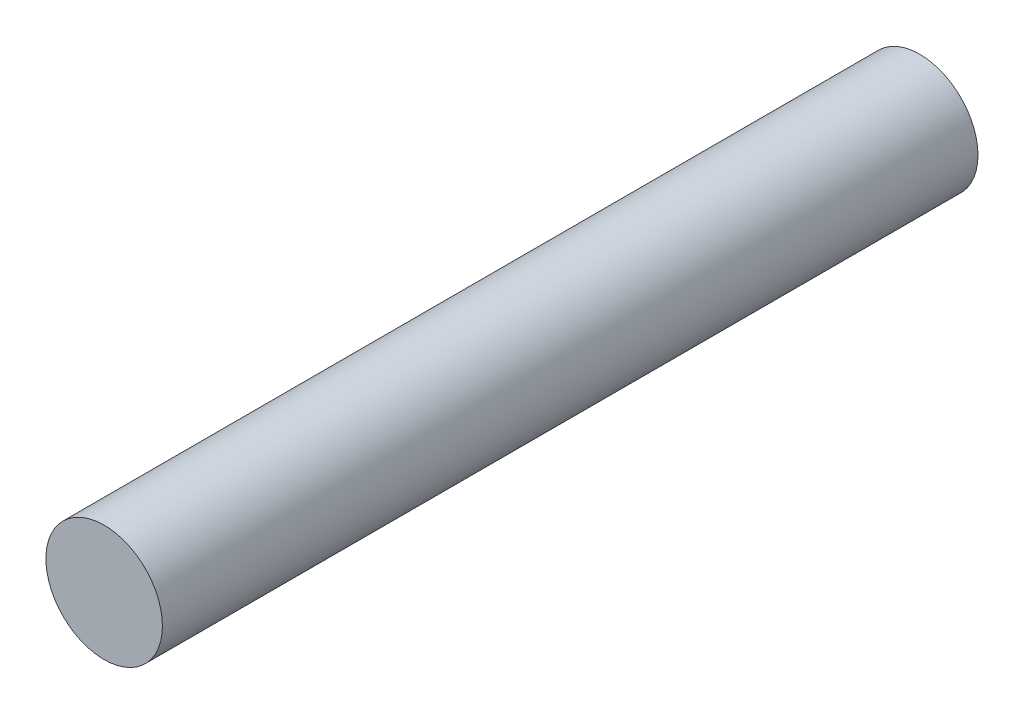
ISO-10303-21;
HEADER;
FILE_DESCRIPTION(('STEP AP214'),'2;1');
FILE_NAME('part.step','',(''),(''),'','','');
FILE_SCHEMA(('AUTOMOTIVE_DESIGN { 1 0 10303 214 1 1 1 1 }'));
ENDSEC;
DATA;
#1=APPLICATION_CONTEXT('core data for automotive mechanical design processes');
#2=APPLICATION_PROTOCOL_DEFINITION('international standard','automotive_design',2000,#1);
#3=PRODUCT_CONTEXT('',#1,'mechanical');
#4=PRODUCT('Part','Part','',(#3));
#5=PRODUCT_RELATED_PRODUCT_CATEGORY('part','',(#4));
#6=PRODUCT_DEFINITION_FORMATION('','',#4);
#7=PRODUCT_DEFINITION_CONTEXT('part definition',#1,'design');
#8=PRODUCT_DEFINITION('design','',#6,#7);
#9=PRODUCT_DEFINITION_SHAPE('','',#8);
#10=(LENGTH_UNIT() NAMED_UNIT(*) SI_UNIT(.MILLI.,.METRE.));
#11=(NAMED_UNIT(*) PLANE_ANGLE_UNIT() SI_UNIT($,.RADIAN.));
#12=(NAMED_UNIT(*) SI_UNIT($,.STERADIAN.) SOLID_ANGLE_UNIT());
#13=UNCERTAINTY_MEASURE_WITH_UNIT(LENGTH_MEASURE(1.E-05),#10,'distance_accuracy_value','');
#14=(GEOMETRIC_REPRESENTATION_CONTEXT(3) GLOBAL_UNCERTAINTY_ASSIGNED_CONTEXT((#13)) GLOBAL_UNIT_ASSIGNED_CONTEXT((#10,
#11,#12)) REPRESENTATION_CONTEXT('',''));
#15=CARTESIAN_POINT('',(0.,0.,0.));
#16=DIRECTION('',(0.,0.,1.));
#17=DIRECTION('',(1.,0.,0.));
#18=AXIS2_PLACEMENT_3D('',#15,#16,#17);
#19=CARTESIAN_POINT('',(0.,0.,17.5));
#20=DIRECTION('',(0.,0.,-1.));
#21=DIRECTION('',(-1.,0.,0.));
#22=AXIS2_PLACEMENT_3D('',#19,#20,#21);
#23=CYLINDRICAL_SURFACE('',#22,2.5);
#24=CARTESIAN_POINT('',(0.,0.,17.5));
#25=DIRECTION('',(0.,0.,1.));
#26=DIRECTION('',(1.,0.,0.));
#27=AXIS2_PLACEMENT_3D('',#24,#25,#26);
#28=CIRCLE('',#27,2.5);
#29=CARTESIAN_POINT('',(2.5,0.,17.5));
#30=VERTEX_POINT('',#29);
#31=EDGE_CURVE('E10',#30,#30,#28,.T.);
#32=ORIENTED_EDGE('',*,*,#31,.F.);
#33=EDGE_LOOP('',(#32));
#34=FACE_BOUND('',#33,.T.);
#35=CARTESIAN_POINT('',(0.,0.,-17.5));
#36=DIRECTION('',(0.,0.,1.));
#37=DIRECTION('',(1.,0.,0.));
#38=AXIS2_PLACEMENT_3D('',#35,#36,#37);
#39=CIRCLE('',#38,2.5);
#40=CARTESIAN_POINT('',(2.5,0.,-17.5));
#41=VERTEX_POINT('',#40);
#42=EDGE_CURVE('E40',#41,#41,#39,.T.);
#43=ORIENTED_EDGE('',*,*,#42,.T.);
#44=EDGE_LOOP('',(#43));
#45=FACE_BOUND('',#44,.T.);
#46=ADVANCED_FACE('F37',(#34,#45),#23,.T.);
#47=CARTESIAN_POINT('',(0.,0.,17.5));
#48=DIRECTION('',(0.,0.,1.));
#49=DIRECTION('',(1.,0.,0.));
#50=AXIS2_PLACEMENT_3D('',#47,#48,#49);
#51=PLANE('',#50);
#52=ORIENTED_EDGE('',*,*,#31,.T.);
#53=EDGE_LOOP('',(#52));
#54=FACE_BOUND('',#53,.T.);
#55=ADVANCED_FACE('F54',(#54),#51,.T.);
#56=CARTESIAN_POINT('',(0.,0.,-17.5));
#57=DIRECTION('',(0.,0.,1.));
#58=DIRECTION('',(1.,0.,0.));
#59=AXIS2_PLACEMENT_3D('',#56,#57,#58);
#60=PLANE('',#59);
#61=ORIENTED_EDGE('',*,*,#42,.F.);
#62=EDGE_LOOP('',(#61));
#63=FACE_BOUND('',#62,.T.);
#64=ADVANCED_FACE('F52',(#63),#60,.F.);
#65=CLOSED_SHELL('',(#46,#55,#64));
#66=MANIFOLD_SOLID_BREP('B2',#65);
#67=ADVANCED_BREP_SHAPE_REPRESENTATION('',(#18,#66),#14);
#68=SHAPE_DEFINITION_REPRESENTATION(#9,#67);
ENDSEC;
END-ISO-10303-21;
